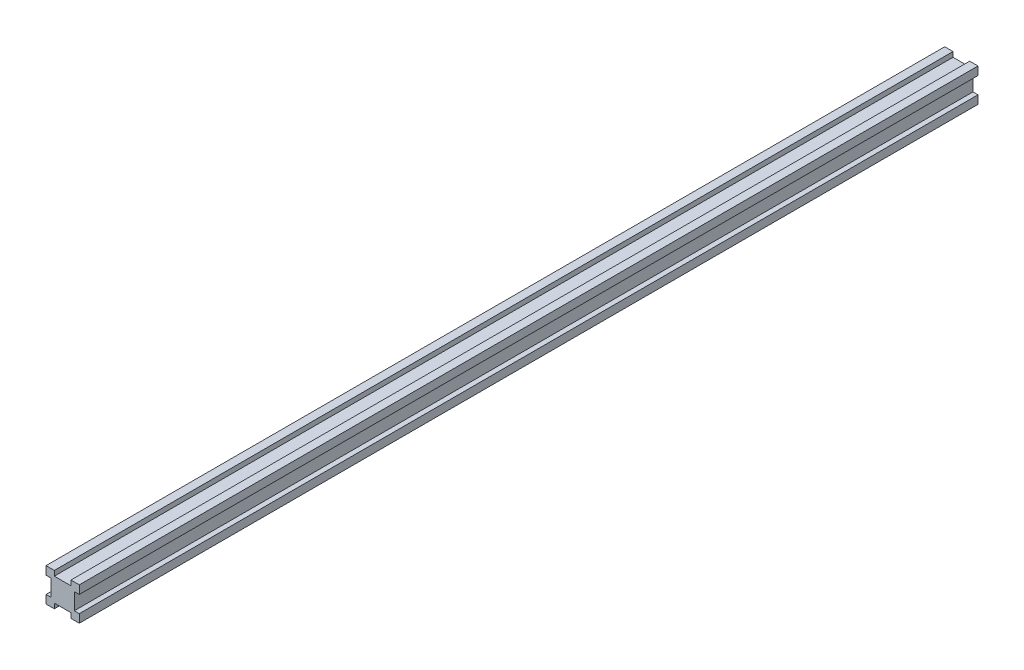
ISO-10303-21;
HEADER;
FILE_DESCRIPTION(('STEP AP214'),'2;1');
FILE_NAME('part.step','',(''),(''),'','','');
FILE_SCHEMA(('AUTOMOTIVE_DESIGN { 1 0 10303 214 1 1 1 1 }'));
ENDSEC;
DATA;
#1=APPLICATION_CONTEXT('core data for automotive mechanical design processes');
#2=APPLICATION_PROTOCOL_DEFINITION('international standard','automotive_design',2000,#1);
#3=PRODUCT_CONTEXT('',#1,'mechanical');
#4=PRODUCT('Part','Part','',(#3));
#5=PRODUCT_RELATED_PRODUCT_CATEGORY('part','',(#4));
#6=PRODUCT_DEFINITION_FORMATION('','',#4);
#7=PRODUCT_DEFINITION_CONTEXT('part definition',#1,'design');
#8=PRODUCT_DEFINITION('design','',#6,#7);
#9=PRODUCT_DEFINITION_SHAPE('','',#8);
#10=(LENGTH_UNIT() NAMED_UNIT(*) SI_UNIT(.MILLI.,.METRE.));
#11=(NAMED_UNIT(*) PLANE_ANGLE_UNIT() SI_UNIT($,.RADIAN.));
#12=(NAMED_UNIT(*) SI_UNIT($,.STERADIAN.) SOLID_ANGLE_UNIT());
#13=UNCERTAINTY_MEASURE_WITH_UNIT(LENGTH_MEASURE(1.E-05),#10,'distance_accuracy_value','');
#14=(GEOMETRIC_REPRESENTATION_CONTEXT(3) GLOBAL_UNCERTAINTY_ASSIGNED_CONTEXT((#13)) GLOBAL_UNIT_ASSIGNED_CONTEXT((#10,
#11,#12)) REPRESENTATION_CONTEXT('',''));
#15=CARTESIAN_POINT('',(0.,0.,0.));
#16=DIRECTION('',(0.,0.,1.));
#17=DIRECTION('',(1.,0.,0.));
#18=AXIS2_PLACEMENT_3D('',#15,#16,#17);
#19=CARTESIAN_POINT('',(-10.,0.,270.));
#20=DIRECTION('',(-1.,0.,0.));
#21=DIRECTION('',(0.,-1.,0.));
#22=AXIS2_PLACEMENT_3D('',#19,#20,#21);
#23=PLANE('',#22);
#24=DIRECTION('',(0.,1.,0.));
#25=VECTOR('',#24,1.);
#26=CARTESIAN_POINT('',(-10.,0.,-270.));
#27=LINE('',#26,#25);
#28=CARTESIAN_POINT('',(-10.,5.,-270.));
#29=VERTEX_POINT('',#28);
#30=CARTESIAN_POINT('',(-10.,10.,-270.));
#31=VERTEX_POINT('',#30);
#32=EDGE_CURVE('E202',#29,#31,#27,.T.);
#33=ORIENTED_EDGE('',*,*,#32,.F.);
#34=DIRECTION('',(0.,0.,-1.));
#35=VECTOR('',#34,1.);
#36=CARTESIAN_POINT('',(-10.,5.,270.));
#37=LINE('',#36,#35);
#38=CARTESIAN_POINT('',(-10.,5.,270.));
#39=VERTEX_POINT('',#38);
#40=EDGE_CURVE('E11',#39,#29,#37,.T.);
#41=ORIENTED_EDGE('',*,*,#40,.F.);
#42=DIRECTION('',(0.,1.,0.));
#43=VECTOR('',#42,1.);
#44=CARTESIAN_POINT('',(-10.,0.,270.));
#45=LINE('',#44,#43);
#46=CARTESIAN_POINT('',(-10.,10.,270.));
#47=VERTEX_POINT('',#46);
#48=EDGE_CURVE('E256',#39,#47,#45,.T.);
#49=ORIENTED_EDGE('',*,*,#48,.T.);
#50=DIRECTION('',(0.,0.,-1.));
#51=VECTOR('',#50,1.);
#52=CARTESIAN_POINT('',(-10.,10.,270.));
#53=LINE('',#52,#51);
#54=EDGE_CURVE('E53',#47,#31,#53,.T.);
#55=ORIENTED_EDGE('',*,*,#54,.T.);
#56=EDGE_LOOP('',(#33,#41,#49,#55));
#57=FACE_BOUND('',#56,.T.);
#58=ADVANCED_FACE('F37',(#57),#23,.T.);
#59=CARTESIAN_POINT('',(0.,5.,270.));
#60=DIRECTION('',(0.,-1.,0.));
#61=DIRECTION('',(1.,0.,0.));
#62=AXIS2_PLACEMENT_3D('',#59,#60,#61);
#63=PLANE('',#62);
#64=DIRECTION('',(-1.,0.,0.));
#65=VECTOR('',#64,1.);
#66=CARTESIAN_POINT('',(0.,5.,-270.));
#67=LINE('',#66,#65);
#68=CARTESIAN_POINT('',(-7.,5.,-270.));
#69=VERTEX_POINT('',#68);
#70=EDGE_CURVE('E204',#69,#29,#67,.T.);
#71=ORIENTED_EDGE('',*,*,#70,.F.);
#72=DIRECTION('',(0.,0.,-1.));
#73=VECTOR('',#72,1.);
#74=CARTESIAN_POINT('',(-7.,5.,270.));
#75=LINE('',#74,#73);
#76=CARTESIAN_POINT('',(-7.,5.,270.));
#77=VERTEX_POINT('',#76);
#78=EDGE_CURVE('E45',#77,#69,#75,.T.);
#79=ORIENTED_EDGE('',*,*,#78,.F.);
#80=DIRECTION('',(-1.,0.,0.));
#81=VECTOR('',#80,1.);
#82=CARTESIAN_POINT('',(0.,5.,270.));
#83=LINE('',#82,#81);
#84=EDGE_CURVE('E311',#77,#39,#83,.T.);
#85=ORIENTED_EDGE('',*,*,#84,.T.);
#86=ORIENTED_EDGE('',*,*,#40,.T.);
#87=EDGE_LOOP('',(#71,#79,#85,#86));
#88=FACE_BOUND('',#87,.T.);
#89=ADVANCED_FACE('F298',(#88),#63,.T.);
#90=CARTESIAN_POINT('',(-7.,0.,270.));
#91=DIRECTION('',(-1.,0.,0.));
#92=DIRECTION('',(0.,-1.,0.));
#93=AXIS2_PLACEMENT_3D('',#90,#91,#92);
#94=PLANE('',#93);
#95=DIRECTION('',(0.,1.,0.));
#96=VECTOR('',#95,1.);
#97=CARTESIAN_POINT('',(-7.,0.,-270.));
#98=LINE('',#97,#96);
#99=CARTESIAN_POINT('',(-7.,-5.,-270.));
#100=VERTEX_POINT('',#99);
#101=EDGE_CURVE('E207',#100,#69,#98,.T.);
#102=ORIENTED_EDGE('',*,*,#101,.F.);
#103=DIRECTION('',(0.,0.,-1.));
#104=VECTOR('',#103,1.);
#105=CARTESIAN_POINT('',(-7.,-5.,270.));
#106=LINE('',#105,#104);
#107=CARTESIAN_POINT('',(-7.,-5.,270.));
#108=VERTEX_POINT('',#107);
#109=EDGE_CURVE('E287',#108,#100,#106,.T.);
#110=ORIENTED_EDGE('',*,*,#109,.F.);
#111=DIRECTION('',(0.,1.,0.));
#112=VECTOR('',#111,1.);
#113=CARTESIAN_POINT('',(-7.,0.,270.));
#114=LINE('',#113,#112);
#115=EDGE_CURVE('E294',#108,#77,#114,.T.);
#116=ORIENTED_EDGE('',*,*,#115,.T.);
#117=ORIENTED_EDGE('',*,*,#78,.T.);
#118=EDGE_LOOP('',(#102,#110,#116,#117));
#119=FACE_BOUND('',#118,.T.);
#120=ADVANCED_FACE('F292',(#119),#94,.T.);
#121=CARTESIAN_POINT('',(0.,-5.,270.));
#122=DIRECTION('',(0.,1.,0.));
#123=DIRECTION('',(-1.,0.,0.));
#124=AXIS2_PLACEMENT_3D('',#121,#122,#123);
#125=PLANE('',#124);
#126=DIRECTION('',(1.,0.,0.));
#127=VECTOR('',#126,1.);
#128=CARTESIAN_POINT('',(0.,-5.,-270.));
#129=LINE('',#128,#127);
#130=CARTESIAN_POINT('',(-10.,-5.,-270.));
#131=VERTEX_POINT('',#130);
#132=EDGE_CURVE('E210',#131,#100,#129,.T.);
#133=ORIENTED_EDGE('',*,*,#132,.F.);
#134=DIRECTION('',(0.,0.,-1.));
#135=VECTOR('',#134,1.);
#136=CARTESIAN_POINT('',(-10.,-5.,270.));
#137=LINE('',#136,#135);
#138=CARTESIAN_POINT('',(-10.,-5.,270.));
#139=VERTEX_POINT('',#138);
#140=EDGE_CURVE('E285',#139,#131,#137,.T.);
#141=ORIENTED_EDGE('',*,*,#140,.F.);
#142=DIRECTION('',(1.,0.,0.));
#143=VECTOR('',#142,1.);
#144=CARTESIAN_POINT('',(0.,-5.,270.));
#145=LINE('',#144,#143);
#146=EDGE_CURVE('E308',#139,#108,#145,.T.);
#147=ORIENTED_EDGE('',*,*,#146,.T.);
#148=ORIENTED_EDGE('',*,*,#109,.T.);
#149=EDGE_LOOP('',(#133,#141,#147,#148));
#150=FACE_BOUND('',#149,.T.);
#151=ADVANCED_FACE('F305',(#150),#125,.T.);
#152=CARTESIAN_POINT('',(-9.99999999999999,0.,270.));
#153=DIRECTION('',(-1.,0.,0.));
#154=DIRECTION('',(0.,-1.,0.));
#155=AXIS2_PLACEMENT_3D('',#152,#153,#154);
#156=PLANE('',#155);
#157=DIRECTION('',(0.,1.,0.));
#158=VECTOR('',#157,1.);
#159=CARTESIAN_POINT('',(-9.99999999999999,0.,-270.));
#160=LINE('',#159,#158);
#161=CARTESIAN_POINT('',(-10.,-10.,-270.));
#162=VERTEX_POINT('',#161);
#163=EDGE_CURVE('E213',#162,#131,#160,.T.);
#164=ORIENTED_EDGE('',*,*,#163,.F.);
#165=DIRECTION('',(0.,0.,-1.));
#166=VECTOR('',#165,1.);
#167=CARTESIAN_POINT('',(-10.,-10.,270.));
#168=LINE('',#167,#166);
#169=CARTESIAN_POINT('',(-10.,-10.,270.));
#170=VERTEX_POINT('',#169);
#171=EDGE_CURVE('E283',#170,#162,#168,.T.);
#172=ORIENTED_EDGE('',*,*,#171,.F.);
#173=DIRECTION('',(0.,1.,0.));
#174=VECTOR('',#173,1.);
#175=CARTESIAN_POINT('',(-9.99999999999999,0.,270.));
#176=LINE('',#175,#174);
#177=EDGE_CURVE('E313',#170,#139,#176,.T.);
#178=ORIENTED_EDGE('',*,*,#177,.T.);
#179=ORIENTED_EDGE('',*,*,#140,.T.);
#180=EDGE_LOOP('',(#164,#172,#178,#179));
#181=FACE_BOUND('',#180,.T.);
#182=ADVANCED_FACE('F371',(#181),#156,.T.);
#183=CARTESIAN_POINT('',(0.,-10.,270.));
#184=DIRECTION('',(0.,1.,0.));
#185=DIRECTION('',(0.,0.,1.));
#186=AXIS2_PLACEMENT_3D('',#183,#184,#185);
#187=PLANE('',#186);
#188=DIRECTION('',(1.,0.,0.));
#189=VECTOR('',#188,1.);
#190=CARTESIAN_POINT('',(0.,-10.,-270.));
#191=LINE('',#190,#189);
#192=CARTESIAN_POINT('',(-5.,-10.,-270.));
#193=VERTEX_POINT('',#192);
#194=EDGE_CURVE('E216',#162,#193,#191,.T.);
#195=ORIENTED_EDGE('',*,*,#194,.T.);
#196=DIRECTION('',(0.,0.,-1.));
#197=VECTOR('',#196,1.);
#198=CARTESIAN_POINT('',(-5.,-10.,270.));
#199=LINE('',#198,#197);
#200=CARTESIAN_POINT('',(-5.,-10.,270.));
#201=VERTEX_POINT('',#200);
#202=EDGE_CURVE('E281',#201,#193,#199,.T.);
#203=ORIENTED_EDGE('',*,*,#202,.F.);
#204=DIRECTION('',(1.,0.,0.));
#205=VECTOR('',#204,1.);
#206=CARTESIAN_POINT('',(0.,-10.,270.));
#207=LINE('',#206,#205);
#208=EDGE_CURVE('E319',#170,#201,#207,.T.);
#209=ORIENTED_EDGE('',*,*,#208,.F.);
#210=ORIENTED_EDGE('',*,*,#171,.T.);
#211=EDGE_LOOP('',(#195,#203,#209,#210));
#212=FACE_BOUND('',#211,.T.);
#213=ADVANCED_FACE('F374',(#212),#187,.F.);
#214=CARTESIAN_POINT('',(-5.,0.,270.));
#215=DIRECTION('',(1.,0.,0.));
#216=DIRECTION('',(0.,0.,-1.));
#217=AXIS2_PLACEMENT_3D('',#214,#215,#216);
#218=PLANE('',#217);
#219=DIRECTION('',(0.,-1.,0.));
#220=VECTOR('',#219,1.);
#221=CARTESIAN_POINT('',(-5.,0.,-270.));
#222=LINE('',#221,#220);
#223=CARTESIAN_POINT('',(-5.,-7.,-270.));
#224=VERTEX_POINT('',#223);
#225=EDGE_CURVE('E219',#224,#193,#222,.T.);
#226=ORIENTED_EDGE('',*,*,#225,.F.);
#227=DIRECTION('',(0.,0.,-1.));
#228=VECTOR('',#227,1.);
#229=CARTESIAN_POINT('',(-5.,-7.,270.));
#230=LINE('',#229,#228);
#231=CARTESIAN_POINT('',(-5.,-7.,270.));
#232=VERTEX_POINT('',#231);
#233=EDGE_CURVE('E279',#232,#224,#230,.T.);
#234=ORIENTED_EDGE('',*,*,#233,.F.);
#235=DIRECTION('',(0.,-1.,0.));
#236=VECTOR('',#235,1.);
#237=CARTESIAN_POINT('',(-5.,0.,270.));
#238=LINE('',#237,#236);
#239=EDGE_CURVE('E321',#232,#201,#238,.T.);
#240=ORIENTED_EDGE('',*,*,#239,.T.);
#241=ORIENTED_EDGE('',*,*,#202,.T.);
#242=EDGE_LOOP('',(#226,#234,#240,#241));
#243=FACE_BOUND('',#242,.T.);
#244=ADVANCED_FACE('F376',(#243),#218,.T.);
#245=CARTESIAN_POINT('',(0.,-7.,270.));
#246=DIRECTION('',(0.,-1.,0.));
#247=DIRECTION('',(1.,0.,0.));
#248=AXIS2_PLACEMENT_3D('',#245,#246,#247);
#249=PLANE('',#248);
#250=DIRECTION('',(-1.,0.,0.));
#251=VECTOR('',#250,1.);
#252=CARTESIAN_POINT('',(0.,-7.,-270.));
#253=LINE('',#252,#251);
#254=CARTESIAN_POINT('',(5.,-7.,-270.));
#255=VERTEX_POINT('',#254);
#256=EDGE_CURVE('E223',#255,#224,#253,.T.);
#257=ORIENTED_EDGE('',*,*,#256,.F.);
#258=DIRECTION('',(0.,0.,-1.));
#259=VECTOR('',#258,1.);
#260=CARTESIAN_POINT('',(5.,-7.,270.));
#261=LINE('',#260,#259);
#262=CARTESIAN_POINT('',(5.,-7.,270.));
#263=VERTEX_POINT('',#262);
#264=EDGE_CURVE('E277',#263,#255,#261,.T.);
#265=ORIENTED_EDGE('',*,*,#264,.F.);
#266=DIRECTION('',(-1.,0.,0.));
#267=VECTOR('',#266,1.);
#268=CARTESIAN_POINT('',(0.,-7.,270.));
#269=LINE('',#268,#267);
#270=EDGE_CURVE('E325',#263,#232,#269,.T.);
#271=ORIENTED_EDGE('',*,*,#270,.T.);
#272=ORIENTED_EDGE('',*,*,#233,.T.);
#273=EDGE_LOOP('',(#257,#265,#271,#272));
#274=FACE_BOUND('',#273,.T.);
#275=ADVANCED_FACE('F379',(#274),#249,.T.);
#276=CARTESIAN_POINT('',(5.,0.,270.));
#277=DIRECTION('',(-1.,0.,0.));
#278=DIRECTION('',(0.,0.,1.));
#279=AXIS2_PLACEMENT_3D('',#276,#277,#278);
#280=PLANE('',#279);
#281=DIRECTION('',(0.,1.,0.));
#282=VECTOR('',#281,1.);
#283=CARTESIAN_POINT('',(5.,0.,-270.));
#284=LINE('',#283,#282);
#285=CARTESIAN_POINT('',(5.,-10.,-270.));
#286=VERTEX_POINT('',#285);
#287=EDGE_CURVE('E226',#286,#255,#284,.T.);
#288=ORIENTED_EDGE('',*,*,#287,.F.);
#289=DIRECTION('',(0.,0.,-1.));
#290=VECTOR('',#289,1.);
#291=CARTESIAN_POINT('',(5.,-10.,270.));
#292=LINE('',#291,#290);
#293=CARTESIAN_POINT('',(5.,-10.,270.));
#294=VERTEX_POINT('',#293);
#295=EDGE_CURVE('E275',#294,#286,#292,.T.);
#296=ORIENTED_EDGE('',*,*,#295,.F.);
#297=DIRECTION('',(0.,1.,0.));
#298=VECTOR('',#297,1.);
#299=CARTESIAN_POINT('',(5.,0.,270.));
#300=LINE('',#299,#298);
#301=EDGE_CURVE('E328',#294,#263,#300,.T.);
#302=ORIENTED_EDGE('',*,*,#301,.T.);
#303=ORIENTED_EDGE('',*,*,#264,.T.);
#304=EDGE_LOOP('',(#288,#296,#302,#303));
#305=FACE_BOUND('',#304,.T.);
#306=ADVANCED_FACE('F383',(#305),#280,.T.);
#307=CARTESIAN_POINT('',(10.,-10.,-270.));
#308=VERTEX_POINT('',#307);
#309=EDGE_CURVE('E220',#286,#308,#191,.T.);
#310=ORIENTED_EDGE('',*,*,#309,.T.);
#311=DIRECTION('',(0.,0.,-1.));
#312=VECTOR('',#311,1.);
#313=CARTESIAN_POINT('',(10.,-10.,270.));
#314=LINE('',#313,#312);
#315=CARTESIAN_POINT('',(10.,-10.,270.));
#316=VERTEX_POINT('',#315);
#317=EDGE_CURVE('E272',#316,#308,#314,.T.);
#318=ORIENTED_EDGE('',*,*,#317,.F.);
#319=EDGE_CURVE('E322',#294,#316,#207,.T.);
#320=ORIENTED_EDGE('',*,*,#319,.F.);
#321=ORIENTED_EDGE('',*,*,#295,.T.);
#322=EDGE_LOOP('',(#310,#318,#320,#321));
#323=FACE_BOUND('',#322,.T.);
#324=ADVANCED_FACE('F387',(#323),#187,.F.);
#325=CARTESIAN_POINT('',(10.,0.,270.));
#326=DIRECTION('',(-1.,0.,0.));
#327=DIRECTION('',(0.,0.,1.));
#328=AXIS2_PLACEMENT_3D('',#325,#326,#327);
#329=PLANE('',#328);
#330=DIRECTION('',(0.,1.,0.));
#331=VECTOR('',#330,1.);
#332=CARTESIAN_POINT('',(10.,0.,-270.));
#333=LINE('',#332,#331);
#334=CARTESIAN_POINT('',(10.,-5.,-270.));
#335=VERTEX_POINT('',#334);
#336=EDGE_CURVE('E229',#308,#335,#333,.T.);
#337=ORIENTED_EDGE('',*,*,#336,.T.);
#338=DIRECTION('',(0.,0.,-1.));
#339=VECTOR('',#338,1.);
#340=CARTESIAN_POINT('',(10.,-5.,270.));
#341=LINE('',#340,#339);
#342=CARTESIAN_POINT('',(10.,-5.,270.));
#343=VERTEX_POINT('',#342);
#344=EDGE_CURVE('E270',#343,#335,#341,.T.);
#345=ORIENTED_EDGE('',*,*,#344,.F.);
#346=DIRECTION('',(0.,1.,0.));
#347=VECTOR('',#346,1.);
#348=CARTESIAN_POINT('',(10.,0.,270.));
#349=LINE('',#348,#347);
#350=EDGE_CURVE('E331',#316,#343,#349,.T.);
#351=ORIENTED_EDGE('',*,*,#350,.F.);
#352=ORIENTED_EDGE('',*,*,#317,.T.);
#353=EDGE_LOOP('',(#337,#345,#351,#352));
#354=FACE_BOUND('',#353,.T.);
#355=ADVANCED_FACE('F391',(#354),#329,.F.);
#356=CARTESIAN_POINT('',(0.,-5.,270.));
#357=DIRECTION('',(0.,1.,0.));
#358=DIRECTION('',(-1.,0.,0.));
#359=AXIS2_PLACEMENT_3D('',#356,#357,#358);
#360=PLANE('',#359);
#361=DIRECTION('',(1.,0.,0.));
#362=VECTOR('',#361,1.);
#363=CARTESIAN_POINT('',(0.,-5.,-270.));
#364=LINE('',#363,#362);
#365=CARTESIAN_POINT('',(7.,-5.,-270.));
#366=VERTEX_POINT('',#365);
#367=EDGE_CURVE('E232',#366,#335,#364,.T.);
#368=ORIENTED_EDGE('',*,*,#367,.F.);
#369=DIRECTION('',(0.,0.,-1.));
#370=VECTOR('',#369,1.);
#371=CARTESIAN_POINT('',(7.,-5.,270.));
#372=LINE('',#371,#370);
#373=CARTESIAN_POINT('',(7.,-5.,270.));
#374=VERTEX_POINT('',#373);
#375=EDGE_CURVE('E268',#374,#366,#372,.T.);
#376=ORIENTED_EDGE('',*,*,#375,.F.);
#377=DIRECTION('',(1.,0.,0.));
#378=VECTOR('',#377,1.);
#379=CARTESIAN_POINT('',(0.,-5.,270.));
#380=LINE('',#379,#378);
#381=EDGE_CURVE('E333',#374,#343,#380,.T.);
#382=ORIENTED_EDGE('',*,*,#381,.T.);
#383=ORIENTED_EDGE('',*,*,#344,.T.);
#384=EDGE_LOOP('',(#368,#376,#382,#383));
#385=FACE_BOUND('',#384,.T.);
#386=ADVANCED_FACE('F395',(#385),#360,.T.);
#387=CARTESIAN_POINT('',(7.,0.,270.));
#388=DIRECTION('',(1.,0.,0.));
#389=DIRECTION('',(0.,0.,-1.));
#390=AXIS2_PLACEMENT_3D('',#387,#388,#389);
#391=PLANE('',#390);
#392=DIRECTION('',(0.,-1.,0.));
#393=VECTOR('',#392,1.);
#394=CARTESIAN_POINT('',(7.,0.,-270.));
#395=LINE('',#394,#393);
#396=CARTESIAN_POINT('',(7.,5.,-270.));
#397=VERTEX_POINT('',#396);
#398=EDGE_CURVE('E235',#397,#366,#395,.T.);
#399=ORIENTED_EDGE('',*,*,#398,.F.);
#400=DIRECTION('',(0.,0.,-1.));
#401=VECTOR('',#400,1.);
#402=CARTESIAN_POINT('',(7.,5.,270.));
#403=LINE('',#402,#401);
#404=CARTESIAN_POINT('',(7.,5.,270.));
#405=VERTEX_POINT('',#404);
#406=EDGE_CURVE('E266',#405,#397,#403,.T.);
#407=ORIENTED_EDGE('',*,*,#406,.F.);
#408=DIRECTION('',(0.,-1.,0.));
#409=VECTOR('',#408,1.);
#410=CARTESIAN_POINT('',(7.,0.,270.));
#411=LINE('',#410,#409);
#412=EDGE_CURVE('E336',#405,#374,#411,.T.);
#413=ORIENTED_EDGE('',*,*,#412,.T.);
#414=ORIENTED_EDGE('',*,*,#375,.T.);
#415=EDGE_LOOP('',(#399,#407,#413,#414));
#416=FACE_BOUND('',#415,.T.);
#417=ADVANCED_FACE('F399',(#416),#391,.T.);
#418=CARTESIAN_POINT('',(0.,5.,270.));
#419=DIRECTION('',(0.,-1.,0.));
#420=DIRECTION('',(1.,0.,0.));
#421=AXIS2_PLACEMENT_3D('',#418,#419,#420);
#422=PLANE('',#421);
#423=DIRECTION('',(-1.,0.,0.));
#424=VECTOR('',#423,1.);
#425=CARTESIAN_POINT('',(0.,5.,-270.));
#426=LINE('',#425,#424);
#427=CARTESIAN_POINT('',(10.,5.,-270.));
#428=VERTEX_POINT('',#427);
#429=EDGE_CURVE('E238',#428,#397,#426,.T.);
#430=ORIENTED_EDGE('',*,*,#429,.F.);
#431=DIRECTION('',(0.,0.,-1.));
#432=VECTOR('',#431,1.);
#433=CARTESIAN_POINT('',(10.,5.,270.));
#434=LINE('',#433,#432);
#435=CARTESIAN_POINT('',(10.,5.,270.));
#436=VERTEX_POINT('',#435);
#437=EDGE_CURVE('E264',#436,#428,#434,.T.);
#438=ORIENTED_EDGE('',*,*,#437,.F.);
#439=DIRECTION('',(-1.,0.,0.));
#440=VECTOR('',#439,1.);
#441=CARTESIAN_POINT('',(0.,5.,270.));
#442=LINE('',#441,#440);
#443=EDGE_CURVE('E339',#436,#405,#442,.T.);
#444=ORIENTED_EDGE('',*,*,#443,.T.);
#445=ORIENTED_EDGE('',*,*,#406,.T.);
#446=EDGE_LOOP('',(#430,#438,#444,#445));
#447=FACE_BOUND('',#446,.T.);
#448=ADVANCED_FACE('F403',(#447),#422,.T.);
#449=CARTESIAN_POINT('',(10.,0.,270.));
#450=DIRECTION('',(-1.,0.,0.));
#451=DIRECTION('',(0.,0.,1.));
#452=AXIS2_PLACEMENT_3D('',#449,#450,#451);
#453=PLANE('',#452);
#454=DIRECTION('',(0.,1.,0.));
#455=VECTOR('',#454,1.);
#456=CARTESIAN_POINT('',(10.,0.,-270.));
#457=LINE('',#456,#455);
#458=CARTESIAN_POINT('',(10.,10.,-270.));
#459=VERTEX_POINT('',#458);
#460=EDGE_CURVE('E241',#428,#459,#457,.T.);
#461=ORIENTED_EDGE('',*,*,#460,.T.);
#462=DIRECTION('',(0.,0.,-1.));
#463=VECTOR('',#462,1.);
#464=CARTESIAN_POINT('',(10.,10.,270.));
#465=LINE('',#464,#463);
#466=CARTESIAN_POINT('',(10.,10.,270.));
#467=VERTEX_POINT('',#466);
#468=EDGE_CURVE('E262',#467,#459,#465,.T.);
#469=ORIENTED_EDGE('',*,*,#468,.F.);
#470=DIRECTION('',(0.,1.,0.));
#471=VECTOR('',#470,1.);
#472=CARTESIAN_POINT('',(10.,0.,270.));
#473=LINE('',#472,#471);
#474=EDGE_CURVE('E342',#436,#467,#473,.T.);
#475=ORIENTED_EDGE('',*,*,#474,.F.);
#476=ORIENTED_EDGE('',*,*,#437,.T.);
#477=EDGE_LOOP('',(#461,#469,#475,#476));
#478=FACE_BOUND('',#477,.T.);
#479=ADVANCED_FACE('F407',(#478),#453,.F.);
#480=CARTESIAN_POINT('',(0.,10.,270.));
#481=DIRECTION('',(0.,1.,0.));
#482=DIRECTION('',(0.,0.,1.));
#483=AXIS2_PLACEMENT_3D('',#480,#481,#482);
#484=PLANE('',#483);
#485=DIRECTION('',(1.,0.,0.));
#486=VECTOR('',#485,1.);
#487=CARTESIAN_POINT('',(0.,10.,-270.));
#488=LINE('',#487,#486);
#489=CARTESIAN_POINT('',(5.,10.,-270.));
#490=VERTEX_POINT('',#489);
#491=EDGE_CURVE('E244',#490,#459,#488,.T.);
#492=ORIENTED_EDGE('',*,*,#491,.F.);
#493=DIRECTION('',(0.,0.,-1.));
#494=VECTOR('',#493,1.);
#495=CARTESIAN_POINT('',(5.,10.,270.));
#496=LINE('',#495,#494);
#497=CARTESIAN_POINT('',(5.,10.,270.));
#498=VERTEX_POINT('',#497);
#499=EDGE_CURVE('E260',#498,#490,#496,.T.);
#500=ORIENTED_EDGE('',*,*,#499,.F.);
#501=DIRECTION('',(1.,0.,0.));
#502=VECTOR('',#501,1.);
#503=CARTESIAN_POINT('',(0.,10.,270.));
#504=LINE('',#503,#502);
#505=EDGE_CURVE('E344',#498,#467,#504,.T.);
#506=ORIENTED_EDGE('',*,*,#505,.T.);
#507=ORIENTED_EDGE('',*,*,#468,.T.);
#508=EDGE_LOOP('',(#492,#500,#506,#507));
#509=FACE_BOUND('',#508,.T.);
#510=ADVANCED_FACE('F411',(#509),#484,.T.);
#511=CARTESIAN_POINT('',(5.,0.,270.));
#512=DIRECTION('',(-1.,0.,0.));
#513=DIRECTION('',(0.,-1.,0.));
#514=AXIS2_PLACEMENT_3D('',#511,#512,#513);
#515=PLANE('',#514);
#516=DIRECTION('',(0.,1.,0.));
#517=VECTOR('',#516,1.);
#518=CARTESIAN_POINT('',(5.,0.,-270.));
#519=LINE('',#518,#517);
#520=CARTESIAN_POINT('',(5.,7.,-270.));
#521=VERTEX_POINT('',#520);
#522=EDGE_CURVE('E247',#521,#490,#519,.T.);
#523=ORIENTED_EDGE('',*,*,#522,.F.);
#524=DIRECTION('',(0.,0.,-1.));
#525=VECTOR('',#524,1.);
#526=CARTESIAN_POINT('',(5.,7.,270.));
#527=LINE('',#526,#525);
#528=CARTESIAN_POINT('',(5.,7.,270.));
#529=VERTEX_POINT('',#528);
#530=EDGE_CURVE('E184',#529,#521,#527,.T.);
#531=ORIENTED_EDGE('',*,*,#530,.F.);
#532=DIRECTION('',(0.,1.,0.));
#533=VECTOR('',#532,1.);
#534=CARTESIAN_POINT('',(5.,0.,270.));
#535=LINE('',#534,#533);
#536=EDGE_CURVE('E194',#529,#498,#535,.T.);
#537=ORIENTED_EDGE('',*,*,#536,.T.);
#538=ORIENTED_EDGE('',*,*,#499,.T.);
#539=EDGE_LOOP('',(#523,#531,#537,#538));
#540=FACE_BOUND('',#539,.T.);
#541=ADVANCED_FACE('F348',(#540),#515,.T.);
#542=CARTESIAN_POINT('',(0.,7.,270.));
#543=DIRECTION('',(0.,1.,0.));
#544=DIRECTION('',(0.,0.,1.));
#545=AXIS2_PLACEMENT_3D('',#542,#543,#544);
#546=PLANE('',#545);
#547=DIRECTION('',(1.,0.,0.));
#548=VECTOR('',#547,1.);
#549=CARTESIAN_POINT('',(0.,7.,-270.));
#550=LINE('',#549,#548);
#551=CARTESIAN_POINT('',(-5.,7.,-270.));
#552=VERTEX_POINT('',#551);
#553=EDGE_CURVE('E180',#552,#521,#550,.T.);
#554=ORIENTED_EDGE('',*,*,#553,.F.);
#555=DIRECTION('',(0.,0.,-1.));
#556=VECTOR('',#555,1.);
#557=CARTESIAN_POINT('',(-5.,7.,270.));
#558=LINE('',#557,#556);
#559=CARTESIAN_POINT('',(-5.,7.,270.));
#560=VERTEX_POINT('',#559);
#561=EDGE_CURVE('E175',#560,#552,#558,.T.);
#562=ORIENTED_EDGE('',*,*,#561,.F.);
#563=DIRECTION('',(1.,0.,0.));
#564=VECTOR('',#563,1.);
#565=CARTESIAN_POINT('',(0.,7.,270.));
#566=LINE('',#565,#564);
#567=EDGE_CURVE('E178',#560,#529,#566,.T.);
#568=ORIENTED_EDGE('',*,*,#567,.T.);
#569=ORIENTED_EDGE('',*,*,#530,.T.);
#570=EDGE_LOOP('',(#554,#562,#568,#569));
#571=FACE_BOUND('',#570,.T.);
#572=ADVANCED_FACE('F177',(#571),#546,.T.);
#573=CARTESIAN_POINT('',(-5.,0.,270.));
#574=DIRECTION('',(1.,0.,0.));
#575=DIRECTION('',(0.,1.,0.));
#576=AXIS2_PLACEMENT_3D('',#573,#574,#575);
#577=PLANE('',#576);
#578=DIRECTION('',(0.,-1.,0.));
#579=VECTOR('',#578,1.);
#580=CARTESIAN_POINT('',(-5.,0.,-270.));
#581=LINE('',#580,#579);
#582=CARTESIAN_POINT('',(-5.,10.,-270.));
#583=VERTEX_POINT('',#582);
#584=EDGE_CURVE('E251',#583,#552,#581,.T.);
#585=ORIENTED_EDGE('',*,*,#584,.F.);
#586=DIRECTION('',(0.,0.,-1.));
#587=VECTOR('',#586,1.);
#588=CARTESIAN_POINT('',(-5.,10.,270.));
#589=LINE('',#588,#587);
#590=CARTESIAN_POINT('',(-5.,10.,270.));
#591=VERTEX_POINT('',#590);
#592=EDGE_CURVE('E114',#591,#583,#589,.T.);
#593=ORIENTED_EDGE('',*,*,#592,.F.);
#594=DIRECTION('',(0.,-1.,0.));
#595=VECTOR('',#594,1.);
#596=CARTESIAN_POINT('',(-5.,0.,270.));
#597=LINE('',#596,#595);
#598=EDGE_CURVE('E191',#591,#560,#597,.T.);
#599=ORIENTED_EDGE('',*,*,#598,.T.);
#600=ORIENTED_EDGE('',*,*,#561,.T.);
#601=EDGE_LOOP('',(#585,#593,#599,#600));
#602=FACE_BOUND('',#601,.T.);
#603=ADVANCED_FACE('F196',(#602),#577,.T.);
#604=CARTESIAN_POINT('',(0.,10.,270.));
#605=DIRECTION('',(0.,1.,0.));
#606=DIRECTION('',(0.,0.,1.));
#607=AXIS2_PLACEMENT_3D('',#604,#605,#606);
#608=PLANE('',#607);
#609=DIRECTION('',(1.,0.,0.));
#610=VECTOR('',#609,1.);
#611=CARTESIAN_POINT('',(0.,10.,-270.));
#612=LINE('',#611,#610);
#613=EDGE_CURVE('E253',#31,#583,#612,.T.);
#614=ORIENTED_EDGE('',*,*,#613,.F.);
#615=ORIENTED_EDGE('',*,*,#54,.F.);
#616=DIRECTION('',(1.,0.,0.));
#617=VECTOR('',#616,1.);
#618=CARTESIAN_POINT('',(0.,10.,270.));
#619=LINE('',#618,#617);
#620=EDGE_CURVE('E197',#47,#591,#619,.T.);
#621=ORIENTED_EDGE('',*,*,#620,.T.);
#622=ORIENTED_EDGE('',*,*,#592,.T.);
#623=EDGE_LOOP('',(#614,#615,#621,#622));
#624=FACE_BOUND('',#623,.T.);
#625=ADVANCED_FACE('F350',(#624),#608,.T.);
#626=CARTESIAN_POINT('',(0.,0.,270.));
#627=DIRECTION('',(0.,0.,1.));
#628=DIRECTION('',(1.,0.,0.));
#629=AXIS2_PLACEMENT_3D('',#626,#627,#628);
#630=PLANE('',#629);
#631=ORIENTED_EDGE('',*,*,#48,.F.);
#632=ORIENTED_EDGE('',*,*,#84,.F.);
#633=ORIENTED_EDGE('',*,*,#115,.F.);
#634=ORIENTED_EDGE('',*,*,#146,.F.);
#635=ORIENTED_EDGE('',*,*,#177,.F.);
#636=ORIENTED_EDGE('',*,*,#208,.T.);
#637=ORIENTED_EDGE('',*,*,#239,.F.);
#638=ORIENTED_EDGE('',*,*,#270,.F.);
#639=ORIENTED_EDGE('',*,*,#301,.F.);
#640=ORIENTED_EDGE('',*,*,#319,.T.);
#641=ORIENTED_EDGE('',*,*,#350,.T.);
#642=ORIENTED_EDGE('',*,*,#381,.F.);
#643=ORIENTED_EDGE('',*,*,#412,.F.);
#644=ORIENTED_EDGE('',*,*,#443,.F.);
#645=ORIENTED_EDGE('',*,*,#474,.T.);
#646=ORIENTED_EDGE('',*,*,#505,.F.);
#647=ORIENTED_EDGE('',*,*,#536,.F.);
#648=ORIENTED_EDGE('',*,*,#567,.F.);
#649=ORIENTED_EDGE('',*,*,#598,.F.);
#650=ORIENTED_EDGE('',*,*,#620,.F.);
#651=EDGE_LOOP('',(#631,#632,#633,#634,#635,#636,#637,#638,#639,#640,#641,#642,#643,#644,#645,
#646,#647,#648,#649,#650));
#652=FACE_BOUND('',#651,.T.);
#653=ADVANCED_FACE('F189',(#652),#630,.T.);
#654=CARTESIAN_POINT('',(0.,0.,-270.));
#655=DIRECTION('',(0.,0.,1.));
#656=DIRECTION('',(1.,0.,0.));
#657=AXIS2_PLACEMENT_3D('',#654,#655,#656);
#658=PLANE('',#657);
#659=ORIENTED_EDGE('',*,*,#32,.T.);
#660=ORIENTED_EDGE('',*,*,#613,.T.);
#661=ORIENTED_EDGE('',*,*,#584,.T.);
#662=ORIENTED_EDGE('',*,*,#553,.T.);
#663=ORIENTED_EDGE('',*,*,#522,.T.);
#664=ORIENTED_EDGE('',*,*,#491,.T.);
#665=ORIENTED_EDGE('',*,*,#460,.F.);
#666=ORIENTED_EDGE('',*,*,#429,.T.);
#667=ORIENTED_EDGE('',*,*,#398,.T.);
#668=ORIENTED_EDGE('',*,*,#367,.T.);
#669=ORIENTED_EDGE('',*,*,#336,.F.);
#670=ORIENTED_EDGE('',*,*,#309,.F.);
#671=ORIENTED_EDGE('',*,*,#287,.T.);
#672=ORIENTED_EDGE('',*,*,#256,.T.);
#673=ORIENTED_EDGE('',*,*,#225,.T.);
#674=ORIENTED_EDGE('',*,*,#194,.F.);
#675=ORIENTED_EDGE('',*,*,#163,.T.);
#676=ORIENTED_EDGE('',*,*,#132,.T.);
#677=ORIENTED_EDGE('',*,*,#101,.T.);
#678=ORIENTED_EDGE('',*,*,#70,.T.);
#679=EDGE_LOOP('',(#659,#660,#661,#662,#663,#664,#665,#666,#667,#668,#669,#670,#671,#672,#673,
#674,#675,#676,#677,#678));
#680=FACE_BOUND('',#679,.T.);
#681=ADVANCED_FACE('F300',(#680),#658,.F.);
#682=CLOSED_SHELL('',(#58,#89,#120,#151,#182,#213,#244,#275,#306,#324,#355,#386,#417,#448,#479,
#510,#541,#572,#603,#625,#653,#681));
#683=MANIFOLD_SOLID_BREP('B2',#682);
#684=ADVANCED_BREP_SHAPE_REPRESENTATION('',(#18,#683),#14);
#685=SHAPE_DEFINITION_REPRESENTATION(#9,#684);
ENDSEC;
END-ISO-10303-21;
